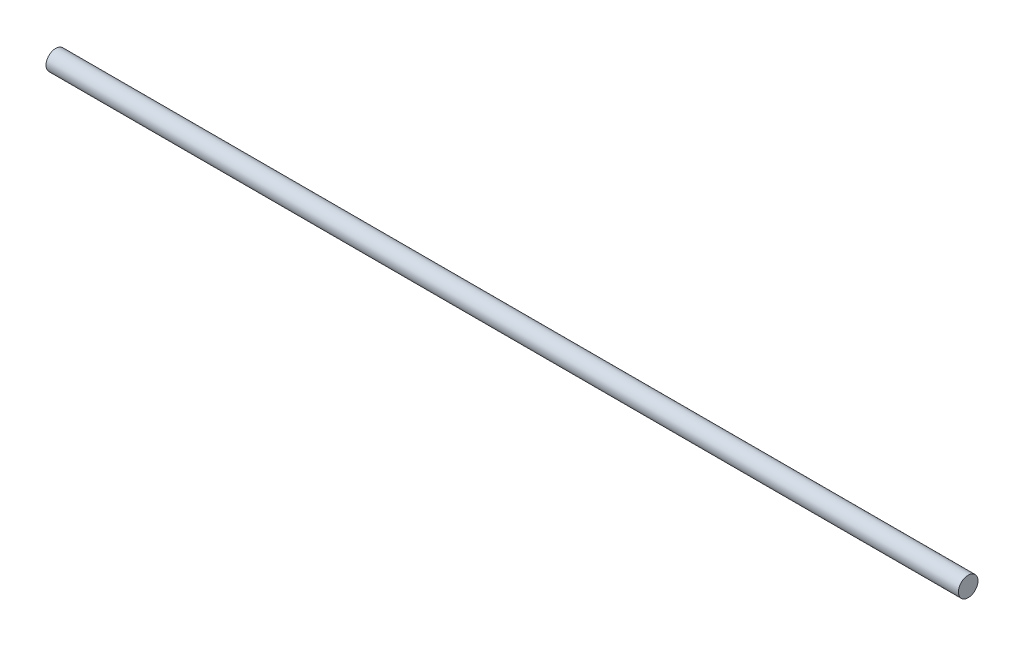
ISO-10303-21;
HEADER;
FILE_DESCRIPTION(('STEP AP214'),'2;1');
FILE_NAME('part.step','',(''),(''),'','','');
FILE_SCHEMA(('AUTOMOTIVE_DESIGN { 1 0 10303 214 1 1 1 1 }'));
ENDSEC;
DATA;
#1=APPLICATION_CONTEXT('core data for automotive mechanical design processes');
#2=APPLICATION_PROTOCOL_DEFINITION('international standard','automotive_design',2000,#1);
#3=PRODUCT_CONTEXT('',#1,'mechanical');
#4=PRODUCT('Part','Part','',(#3));
#5=PRODUCT_RELATED_PRODUCT_CATEGORY('part','',(#4));
#6=PRODUCT_DEFINITION_FORMATION('','',#4);
#7=PRODUCT_DEFINITION_CONTEXT('part definition',#1,'design');
#8=PRODUCT_DEFINITION('design','',#6,#7);
#9=PRODUCT_DEFINITION_SHAPE('','',#8);
#10=(LENGTH_UNIT() NAMED_UNIT(*) SI_UNIT(.MILLI.,.METRE.));
#11=(NAMED_UNIT(*) PLANE_ANGLE_UNIT() SI_UNIT($,.RADIAN.));
#12=(NAMED_UNIT(*) SI_UNIT($,.STERADIAN.) SOLID_ANGLE_UNIT());
#13=UNCERTAINTY_MEASURE_WITH_UNIT(LENGTH_MEASURE(1.E-05),#10,'distance_accuracy_value','');
#14=(GEOMETRIC_REPRESENTATION_CONTEXT(3) GLOBAL_UNCERTAINTY_ASSIGNED_CONTEXT((#13)) GLOBAL_UNIT_ASSIGNED_CONTEXT((#10,
#11,#12)) REPRESENTATION_CONTEXT('',''));
#15=CARTESIAN_POINT('',(0.,0.,0.));
#16=DIRECTION('',(0.,0.,1.));
#17=DIRECTION('',(1.,0.,0.));
#18=AXIS2_PLACEMENT_3D('',#15,#16,#17);
#19=CARTESIAN_POINT('',(70.,0.,0.));
#20=DIRECTION('',(-1.,0.,0.));
#21=DIRECTION('',(0.,0.,1.));
#22=AXIS2_PLACEMENT_3D('',#19,#20,#21);
#23=CYLINDRICAL_SURFACE('',#22,1.5);
#24=CARTESIAN_POINT('',(70.,0.,0.));
#25=DIRECTION('',(1.,0.,0.));
#26=DIRECTION('',(0.,0.,-1.));
#27=AXIS2_PLACEMENT_3D('',#24,#25,#26);
#28=CIRCLE('',#27,1.5);
#29=CARTESIAN_POINT('',(70.,0.,-1.5));
#30=VERTEX_POINT('',#29);
#31=EDGE_CURVE('E10',#30,#30,#28,.T.);
#32=ORIENTED_EDGE('',*,*,#31,.F.);
#33=EDGE_LOOP('',(#32));
#34=FACE_BOUND('',#33,.T.);
#35=CARTESIAN_POINT('',(-70.,0.,0.));
#36=DIRECTION('',(1.,0.,0.));
#37=DIRECTION('',(0.,0.,-1.));
#38=AXIS2_PLACEMENT_3D('',#35,#36,#37);
#39=CIRCLE('',#38,1.5);
#40=CARTESIAN_POINT('',(-70.,0.,-1.5));
#41=VERTEX_POINT('',#40);
#42=EDGE_CURVE('E34',#41,#41,#39,.T.);
#43=ORIENTED_EDGE('',*,*,#42,.T.);
#44=EDGE_LOOP('',(#43));
#45=FACE_BOUND('',#44,.T.);
#46=ADVANCED_FACE('F31',(#34,#45),#23,.T.);
#47=CARTESIAN_POINT('',(70.,0.,0.));
#48=DIRECTION('',(1.,0.,0.));
#49=DIRECTION('',(0.,0.,-1.));
#50=AXIS2_PLACEMENT_3D('',#47,#48,#49);
#51=PLANE('',#50);
#52=ORIENTED_EDGE('',*,*,#31,.T.);
#53=EDGE_LOOP('',(#52));
#54=FACE_BOUND('',#53,.T.);
#55=ADVANCED_FACE('F46',(#54),#51,.T.);
#56=CARTESIAN_POINT('',(-70.,0.,0.));
#57=DIRECTION('',(1.,0.,0.));
#58=DIRECTION('',(0.,0.,-1.));
#59=AXIS2_PLACEMENT_3D('',#56,#57,#58);
#60=PLANE('',#59);
#61=ORIENTED_EDGE('',*,*,#42,.F.);
#62=EDGE_LOOP('',(#61));
#63=FACE_BOUND('',#62,.T.);
#64=ADVANCED_FACE('F44',(#63),#60,.F.);
#65=CLOSED_SHELL('',(#46,#55,#64));
#66=MANIFOLD_SOLID_BREP('B2',#65);
#67=ADVANCED_BREP_SHAPE_REPRESENTATION('',(#18,#66),#14);
#68=SHAPE_DEFINITION_REPRESENTATION(#9,#67);
ENDSEC;
END-ISO-10303-21;
